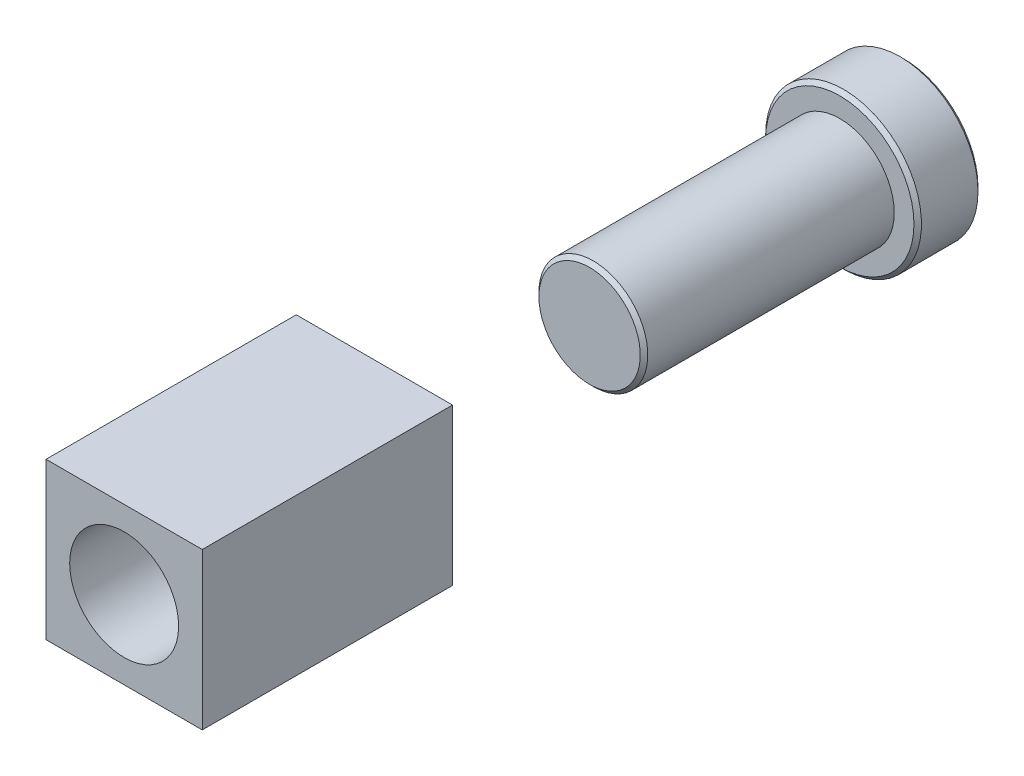
ISO-10303-21;
HEADER;
FILE_DESCRIPTION(('STEP AP214'),'2;1');
FILE_NAME('part.step','',(''),(''),'','','');
FILE_SCHEMA(('AUTOMOTIVE_DESIGN { 1 0 10303 214 1 1 1 1 }'));
ENDSEC;
DATA;
#1=APPLICATION_CONTEXT('core data for automotive mechanical design processes');
#2=APPLICATION_PROTOCOL_DEFINITION('international standard','automotive_design',2000,#1);
#3=PRODUCT_CONTEXT('',#1,'mechanical');
#4=PRODUCT('Part','Part','',(#3));
#5=PRODUCT_RELATED_PRODUCT_CATEGORY('part','',(#4));
#6=PRODUCT_DEFINITION_FORMATION('','',#4);
#7=PRODUCT_DEFINITION_CONTEXT('part definition',#1,'design');
#8=PRODUCT_DEFINITION('design','',#6,#7);
#9=PRODUCT_DEFINITION_SHAPE('','',#8);
#10=(LENGTH_UNIT() NAMED_UNIT(*) SI_UNIT(.MILLI.,.METRE.));
#11=(NAMED_UNIT(*) PLANE_ANGLE_UNIT() SI_UNIT($,.RADIAN.));
#12=(NAMED_UNIT(*) SI_UNIT($,.STERADIAN.) SOLID_ANGLE_UNIT());
#13=UNCERTAINTY_MEASURE_WITH_UNIT(LENGTH_MEASURE(1.E-05),#10,'distance_accuracy_value','');
#14=(GEOMETRIC_REPRESENTATION_CONTEXT(3) GLOBAL_UNCERTAINTY_ASSIGNED_CONTEXT((#13)) GLOBAL_UNIT_ASSIGNED_CONTEXT((#10,
#11,#12)) REPRESENTATION_CONTEXT('',''));
#15=CARTESIAN_POINT('',(0.,0.,0.));
#16=DIRECTION('',(0.,0.,1.));
#17=DIRECTION('',(1.,0.,0.));
#18=AXIS2_PLACEMENT_3D('',#15,#16,#17);
#19=CARTESIAN_POINT('',(-15.8613491960392,15.8613491960392,158.283276511442));
#20=DIRECTION('',(1.,0.,0.));
#21=DIRECTION('',(0.,1.,0.));
#22=AXIS2_PLACEMENT_3D('',#19,#20,#21);
#23=PLANE('',#22);
#24=DIRECTION('',(0.,-1.,0.));
#25=VECTOR('',#24,1.);
#26=CARTESIAN_POINT('',(-15.8613491960392,15.8613491960392,107.483276511442));
#27=LINE('',#26,#25);
#28=CARTESIAN_POINT('',(-15.8613491960392,15.8613491960392,107.483276511442));
#29=VERTEX_POINT('',#28);
#30=CARTESIAN_POINT('',(-15.8613491960392,-15.8613491960392,107.483276511442));
#31=VERTEX_POINT('',#30);
#32=EDGE_CURVE('E110',#29,#31,#27,.T.);
#33=ORIENTED_EDGE('',*,*,#32,.T.);
#34=DIRECTION('',(0.,0.,-1.));
#35=VECTOR('',#34,1.);
#36=CARTESIAN_POINT('',(-15.8613491960392,-15.8613491960392,158.283276511442));
#37=LINE('',#36,#35);
#38=CARTESIAN_POINT('',(-15.8613491960392,-15.8613491960392,158.283276511442));
#39=VERTEX_POINT('',#38);
#40=EDGE_CURVE('E12',#39,#31,#37,.T.);
#41=ORIENTED_EDGE('',*,*,#40,.F.);
#42=DIRECTION('',(0.,-1.,0.));
#43=VECTOR('',#42,1.);
#44=CARTESIAN_POINT('',(-15.8613491960392,15.8613491960392,158.283276511442));
#45=LINE('',#44,#43);
#46=CARTESIAN_POINT('',(-15.8613491960392,15.8613491960392,158.283276511442));
#47=VERTEX_POINT('',#46);
#48=EDGE_CURVE('E98',#47,#39,#45,.T.);
#49=ORIENTED_EDGE('',*,*,#48,.F.);
#50=DIRECTION('',(0.,0.,-1.));
#51=VECTOR('',#50,1.);
#52=CARTESIAN_POINT('',(-15.8613491960392,15.8613491960392,158.283276511442));
#53=LINE('',#52,#51);
#54=EDGE_CURVE('E106',#47,#29,#53,.T.);
#55=ORIENTED_EDGE('',*,*,#54,.T.);
#56=EDGE_LOOP('',(#33,#41,#49,#55));
#57=FACE_BOUND('',#56,.T.);
#58=ADVANCED_FACE('F47',(#57),#23,.F.);
#59=CARTESIAN_POINT('',(-15.8613491960392,-15.8613491960392,158.283276511442));
#60=DIRECTION('',(0.,1.,0.));
#61=DIRECTION('',(0.,0.,1.));
#62=AXIS2_PLACEMENT_3D('',#59,#60,#61);
#63=PLANE('',#62);
#64=DIRECTION('',(1.,0.,0.));
#65=VECTOR('',#64,1.);
#66=CARTESIAN_POINT('',(-15.8613491960392,-15.8613491960392,107.483276511442));
#67=LINE('',#66,#65);
#68=CARTESIAN_POINT('',(15.8613491960392,-15.8613491960392,107.483276511442));
#69=VERTEX_POINT('',#68);
#70=EDGE_CURVE('E102',#31,#69,#67,.T.);
#71=ORIENTED_EDGE('',*,*,#70,.T.);
#72=DIRECTION('',(0.,0.,-1.));
#73=VECTOR('',#72,1.);
#74=CARTESIAN_POINT('',(15.8613491960392,-15.8613491960392,158.283276511442));
#75=LINE('',#74,#73);
#76=CARTESIAN_POINT('',(15.8613491960392,-15.8613491960392,158.283276511442));
#77=VERTEX_POINT('',#76);
#78=EDGE_CURVE('E55',#77,#69,#75,.T.);
#79=ORIENTED_EDGE('',*,*,#78,.F.);
#80=DIRECTION('',(1.,0.,0.));
#81=VECTOR('',#80,1.);
#82=CARTESIAN_POINT('',(-15.8613491960392,-15.8613491960392,158.283276511442));
#83=LINE('',#82,#81);
#84=EDGE_CURVE('E93',#39,#77,#83,.T.);
#85=ORIENTED_EDGE('',*,*,#84,.F.);
#86=ORIENTED_EDGE('',*,*,#40,.T.);
#87=EDGE_LOOP('',(#71,#79,#85,#86));
#88=FACE_BOUND('',#87,.T.);
#89=ADVANCED_FACE('F101',(#88),#63,.F.);
#90=CARTESIAN_POINT('',(15.8613491960392,15.8613491960392,158.283276511442));
#91=DIRECTION('',(-1.,0.,0.));
#92=DIRECTION('',(0.,-1.,0.));
#93=AXIS2_PLACEMENT_3D('',#90,#91,#92);
#94=PLANE('',#93);
#95=DIRECTION('',(0.,1.,0.));
#96=VECTOR('',#95,1.);
#97=CARTESIAN_POINT('',(15.8613491960392,15.8613491960392,107.483276511442));
#98=LINE('',#97,#96);
#99=CARTESIAN_POINT('',(15.8613491960392,15.8613491960392,107.483276511442));
#100=VERTEX_POINT('',#99);
#101=EDGE_CURVE('E80',#69,#100,#98,.T.);
#102=ORIENTED_EDGE('',*,*,#101,.T.);
#103=DIRECTION('',(0.,0.,-1.));
#104=VECTOR('',#103,1.);
#105=CARTESIAN_POINT('',(15.8613491960392,15.8613491960392,158.283276511442));
#106=LINE('',#105,#104);
#107=CARTESIAN_POINT('',(15.8613491960392,15.8613491960392,158.283276511442));
#108=VERTEX_POINT('',#107);
#109=EDGE_CURVE('E103',#108,#100,#106,.T.);
#110=ORIENTED_EDGE('',*,*,#109,.F.);
#111=DIRECTION('',(0.,1.,0.));
#112=VECTOR('',#111,1.);
#113=CARTESIAN_POINT('',(15.8613491960392,15.8613491960392,158.283276511442));
#114=LINE('',#113,#112);
#115=EDGE_CURVE('E96',#77,#108,#114,.T.);
#116=ORIENTED_EDGE('',*,*,#115,.F.);
#117=ORIENTED_EDGE('',*,*,#78,.T.);
#118=EDGE_LOOP('',(#102,#110,#116,#117));
#119=FACE_BOUND('',#118,.T.);
#120=ADVANCED_FACE('F104',(#119),#94,.F.);
#121=CARTESIAN_POINT('',(-15.8613491960392,15.8613491960392,158.283276511442));
#122=DIRECTION('',(0.,-1.,0.));
#123=DIRECTION('',(0.,0.,-1.));
#124=AXIS2_PLACEMENT_3D('',#121,#122,#123);
#125=PLANE('',#124);
#126=DIRECTION('',(-1.,0.,0.));
#127=VECTOR('',#126,1.);
#128=CARTESIAN_POINT('',(-15.8613491960392,15.8613491960392,107.483276511442));
#129=LINE('',#128,#127);
#130=EDGE_CURVE('E86',#100,#29,#129,.T.);
#131=ORIENTED_EDGE('',*,*,#130,.T.);
#132=ORIENTED_EDGE('',*,*,#54,.F.);
#133=DIRECTION('',(-1.,0.,0.));
#134=VECTOR('',#133,1.);
#135=CARTESIAN_POINT('',(-15.8613491960392,15.8613491960392,158.283276511442));
#136=LINE('',#135,#134);
#137=EDGE_CURVE('E63',#108,#47,#136,.T.);
#138=ORIENTED_EDGE('',*,*,#137,.F.);
#139=ORIENTED_EDGE('',*,*,#109,.T.);
#140=EDGE_LOOP('',(#131,#132,#138,#139));
#141=FACE_BOUND('',#140,.T.);
#142=ADVANCED_FACE('F118',(#141),#125,.F.);
#143=CARTESIAN_POINT('',(0.,0.,158.283276511442));
#144=DIRECTION('',(0.,0.,1.));
#145=DIRECTION('',(1.,0.,0.));
#146=AXIS2_PLACEMENT_3D('',#143,#144,#145);
#147=PLANE('',#146);
#148=CARTESIAN_POINT('',(0.,0.,158.283276511442));
#149=DIRECTION('',(0.,0.,-1.));
#150=DIRECTION('',(-1.,0.,0.));
#151=AXIS2_PLACEMENT_3D('',#148,#149,#150);
#152=CIRCLE('',#151,11.05535);
#153=CARTESIAN_POINT('',(-11.05535,0.,158.283276511442));
#154=VERTEX_POINT('',#153);
#155=EDGE_CURVE('E113',#154,#154,#152,.T.);
#156=ORIENTED_EDGE('',*,*,#155,.T.);
#157=EDGE_LOOP('',(#156));
#158=FACE_BOUND('',#157,.T.);
#159=ORIENTED_EDGE('',*,*,#48,.T.);
#160=ORIENTED_EDGE('',*,*,#84,.T.);
#161=ORIENTED_EDGE('',*,*,#115,.T.);
#162=ORIENTED_EDGE('',*,*,#137,.T.);
#163=EDGE_LOOP('',(#159,#160,#161,#162));
#164=FACE_BOUND('',#163,.T.);
#165=ADVANCED_FACE('F94',(#158,#164),#147,.T.);
#166=CARTESIAN_POINT('',(0.,0.,107.483276511442));
#167=DIRECTION('',(0.,0.,1.));
#168=DIRECTION('',(1.,0.,0.));
#169=AXIS2_PLACEMENT_3D('',#166,#167,#168);
#170=PLANE('',#169);
#171=CARTESIAN_POINT('',(0.,0.,107.483276511442));
#172=DIRECTION('',(0.,0.,-1.));
#173=DIRECTION('',(-1.,0.,0.));
#174=AXIS2_PLACEMENT_3D('',#171,#172,#173);
#175=CIRCLE('',#174,11.05535);
#176=CARTESIAN_POINT('',(-11.05535,0.,107.483276511442));
#177=VERTEX_POINT('',#176);
#178=EDGE_CURVE('E124',#177,#177,#175,.T.);
#179=ORIENTED_EDGE('',*,*,#178,.F.);
#180=EDGE_LOOP('',(#179));
#181=FACE_BOUND('',#180,.T.);
#182=ORIENTED_EDGE('',*,*,#32,.F.);
#183=ORIENTED_EDGE('',*,*,#130,.F.);
#184=ORIENTED_EDGE('',*,*,#101,.F.);
#185=ORIENTED_EDGE('',*,*,#70,.F.);
#186=EDGE_LOOP('',(#182,#183,#184,#185));
#187=FACE_BOUND('',#186,.T.);
#188=ADVANCED_FACE('F121',(#181,#187),#170,.F.);
#189=CARTESIAN_POINT('',(0.,0.,158.283276511442));
#190=DIRECTION('',(0.,0.,-1.));
#191=DIRECTION('',(-1.,0.,0.));
#192=AXIS2_PLACEMENT_3D('',#189,#190,#191);
#193=CYLINDRICAL_SURFACE('',#192,11.05535);
#194=ORIENTED_EDGE('',*,*,#155,.F.);
#195=EDGE_LOOP('',(#194));
#196=FACE_BOUND('',#195,.T.);
#197=ORIENTED_EDGE('',*,*,#178,.T.);
#198=EDGE_LOOP('',(#197));
#199=FACE_BOUND('',#198,.T.);
#200=ADVANCED_FACE('F131',(#196,#199),#193,.F.);
#201=CLOSED_SHELL('',(#58,#89,#120,#142,#165,#188,#200));
#202=MANIFOLD_SOLID_BREP('B2',#201);
#203=CARTESIAN_POINT('',(0.,0.,12.9988235294118));
#204=DIRECTION('',(0.,0.,1.));
#205=DIRECTION('',(1.,0.,0.));
#206=AXIS2_PLACEMENT_3D('',#203,#204,#205);
#207=PLANE('',#206);
#208=CARTESIAN_POINT('',(0.,0.,12.9988235294118));
#209=DIRECTION('',(0.,0.,1.));
#210=DIRECTION('',(1.,0.,0.));
#211=AXIS2_PLACEMENT_3D('',#208,#209,#210);
#212=CIRCLE('',#211,15.0495000000001);
#213=CARTESIAN_POINT('',(15.0495000000001,0.,12.9988235294118));
#214=VERTEX_POINT('',#213);
#215=EDGE_CURVE('E203',#214,#214,#212,.T.);
#216=ORIENTED_EDGE('',*,*,#215,.T.);
#217=EDGE_LOOP('',(#216));
#218=FACE_BOUND('',#217,.T.);
#219=CARTESIAN_POINT('',(0.,0.,12.9988235294118));
#220=DIRECTION('',(0.,0.,1.));
#221=DIRECTION('',(1.,0.,0.));
#222=AXIS2_PLACEMENT_3D('',#219,#220,#221);
#223=CIRCLE('',#222,11.049);
#224=CARTESIAN_POINT('',(11.049,0.,12.9988235294118));
#225=VERTEX_POINT('',#224);
#226=EDGE_CURVE('E218',#225,#225,#223,.T.);
#227=ORIENTED_EDGE('',*,*,#226,.F.);
#228=EDGE_LOOP('',(#227));
#229=FACE_BOUND('',#228,.T.);
#230=ADVANCED_FACE('F192',(#218,#229),#207,.T.);
#231=CARTESIAN_POINT('',(0.,0.,12.9988235294118));
#232=DIRECTION('',(0.,0.,-1.));
#233=DIRECTION('',(-1.,0.,0.));
#234=AXIS2_PLACEMENT_3D('',#231,#232,#233);
#235=CYLINDRICAL_SURFACE('',#234,15.8115);
#236=CARTESIAN_POINT('',(0.,0.,0.762000000000034));
#237=DIRECTION('',(0.,0.,1.));
#238=DIRECTION('',(1.,0.,0.));
#239=AXIS2_PLACEMENT_3D('',#236,#237,#238);
#240=CIRCLE('',#239,15.8115);
#241=CARTESIAN_POINT('',(-15.8115,0.,0.762000000000032));
#242=VERTEX_POINT('',#241);
#243=EDGE_CURVE('E212',#242,#242,#240,.T.);
#244=CARTESIAN_POINT('',(0.,0.,12.2368235294118));
#245=DIRECTION('',(0.,0.,1.));
#246=DIRECTION('',(1.,0.,0.));
#247=AXIS2_PLACEMENT_3D('',#244,#245,#246);
#248=CIRCLE('',#247,15.8115);
#249=CARTESIAN_POINT('',(-15.8115,0.,12.2368235294118));
#250=VERTEX_POINT('',#249);
#251=EDGE_CURVE('E215',#250,#250,#248,.F.);
#252=CARTESIAN_POINT('',(-15.8115,0.,0.762000000000032));
#253=CARTESIAN_POINT('',(-15.8115,0.,0.881529411764738));
#254=CARTESIAN_POINT('',(-15.8115,0.,1.00105882352944));
#255=CARTESIAN_POINT('',(-15.8115,0.,1.24011764705886));
#256=CARTESIAN_POINT('',(-15.8115,0.,1.35964705882356));
#257=CARTESIAN_POINT('',(-15.8115,0.,1.59870588235297));
#258=CARTESIAN_POINT('',(-15.8115,0.,1.71823529411768));
#259=CARTESIAN_POINT('',(-15.8115,0.,1.95729411764709));
#260=CARTESIAN_POINT('',(-15.8115,0.,2.0768235294118));
#261=CARTESIAN_POINT('',(-15.8115,0.,2.31588235294121));
#262=CARTESIAN_POINT('',(-15.8115,0.,2.43541176470592));
#263=CARTESIAN_POINT('',(-15.8115,0.,2.67447058823533));
#264=CARTESIAN_POINT('',(-15.8115,0.,2.79400000000004));
#265=CARTESIAN_POINT('',(-15.8115,0.,3.03305882352945));
#266=CARTESIAN_POINT('',(-15.8115,0.,3.15258823529415));
#267=CARTESIAN_POINT('',(-15.8115,0.,3.39164705882357));
#268=CARTESIAN_POINT('',(-15.8115,0.,3.51117647058827));
#269=CARTESIAN_POINT('',(-15.8115,0.,3.75023529411768));
#270=CARTESIAN_POINT('',(-15.8115,0.,3.86976470588239));
#271=CARTESIAN_POINT('',(-15.8115,0.,4.1088235294118));
#272=CARTESIAN_POINT('',(-15.8115,0.,4.22835294117651));
#273=CARTESIAN_POINT('',(-15.8115,0.,4.46741176470592));
#274=CARTESIAN_POINT('',(-15.8115,0.,4.58694117647063));
#275=CARTESIAN_POINT('',(-15.8115,0.,4.82600000000004));
#276=CARTESIAN_POINT('',(-15.8115,0.,4.94552941176475));
#277=CARTESIAN_POINT('',(-15.8115,0.,5.18458823529416));
#278=CARTESIAN_POINT('',(-15.8115,0.,5.30411764705886));
#279=CARTESIAN_POINT('',(-15.8115,0.,5.54317647058827));
#280=CARTESIAN_POINT('',(-15.8115,0.,5.66270588235298));
#281=CARTESIAN_POINT('',(-15.8115,0.,5.90176470588239));
#282=CARTESIAN_POINT('',(-15.8115,0.,6.0212941176471));
#283=CARTESIAN_POINT('',(-15.8115,0.,6.26035294117651));
#284=CARTESIAN_POINT('',(-15.8115,0.,6.37988235294122));
#285=CARTESIAN_POINT('',(-15.8115,0.,6.61894117647063));
#286=CARTESIAN_POINT('',(-15.8115,0.,6.73847058823534));
#287=CARTESIAN_POINT('',(-15.8115,0.,6.97752941176475));
#288=CARTESIAN_POINT('',(-15.8115,0.,7.09705882352945));
#289=CARTESIAN_POINT('',(-15.8115,0.,7.33611764705887));
#290=CARTESIAN_POINT('',(-15.8115,0.,7.45564705882357));
#291=CARTESIAN_POINT('',(-15.8115,0.,7.69470588235298));
#292=CARTESIAN_POINT('',(-15.8115,0.,7.81423529411769));
#293=CARTESIAN_POINT('',(-15.8115,0.,8.0532941176471));
#294=CARTESIAN_POINT('',(-15.8115,0.,8.17282352941181));
#295=CARTESIAN_POINT('',(-15.8115,0.,8.41188235294122));
#296=CARTESIAN_POINT('',(-15.8115,0.,8.53141176470593));
#297=CARTESIAN_POINT('',(-15.8115,0.,8.77047058823534));
#298=CARTESIAN_POINT('',(-15.8115,0.,8.89000000000004));
#299=CARTESIAN_POINT('',(-15.8115,0.,9.12905882352946));
#300=CARTESIAN_POINT('',(-15.8115,0.,9.24858823529416));
#301=CARTESIAN_POINT('',(-15.8115,0.,9.48764705882357));
#302=CARTESIAN_POINT('',(-15.8115,0.,9.60717647058828));
#303=CARTESIAN_POINT('',(-15.8115,0.,9.84623529411769));
#304=CARTESIAN_POINT('',(-15.8115,0.,9.9657647058824));
#305=CARTESIAN_POINT('',(-15.8115,0.,10.2048235294118));
#306=CARTESIAN_POINT('',(-15.8115,0.,10.3243529411765));
#307=CARTESIAN_POINT('',(-15.8115,0.,10.5634117647059));
#308=CARTESIAN_POINT('',(-15.8115,0.,10.6829411764706));
#309=CARTESIAN_POINT('',(-15.8115,0.,10.922));
#310=CARTESIAN_POINT('',(-15.8115,0.,11.0415294117648));
#311=CARTESIAN_POINT('',(-15.8115,0.,11.2805882352942));
#312=CARTESIAN_POINT('',(-15.8115,0.,11.4001176470589));
#313=CARTESIAN_POINT('',(-15.8115,0.,11.6391764705883));
#314=CARTESIAN_POINT('',(-15.8115,0.,11.758705882353));
#315=CARTESIAN_POINT('',(-15.8115,0.,11.9977647058824));
#316=CARTESIAN_POINT('',(-15.8115,0.,12.1172941176471));
#317=CARTESIAN_POINT('',(-15.8115,0.,12.2368235294118));
#318=B_SPLINE_CURVE_WITH_KNOTS('',3,(#252,#253,#254,#255,#256,#257,#258,#259,#260,#261,#262,
#263,#264,#265,#266,#267,#268,#269,#270,#271,#272,#273,#274,#275,#276,#277,#278,#279,#280,#281,
#282,#283,#284,#285,#286,#287,#288,#289,#290,#291,#292,#293,#294,#295,#296,#297,#298,#299,#300,
#301,#302,#303,#304,#305,#306,#307,#308,#309,#310,#311,#312,#313,#314,#315,#316,#317),
.UNSPECIFIED.,.F.,.F.,(4,2,2,2,2,2,2,2,2,2,2,2,2,2,2,2,2,2,2,2,2,2,2,2,2,2,2,2,2,2,2,2,4),(0.,
0.358588235294117,0.717176470588237,1.07576470588235,1.43435294117647,1.79294117647059,
2.15152941176471,2.51011764705883,2.86870588235295,3.22729411764706,3.58588235294118,
3.9444705882353,4.30305882352942,4.66164705882354,5.02023529411766,5.37882352941177,
5.73741176470589,6.09600000000001,6.45458823529413,6.81317647058825,7.17176470588237,
7.53035294117648,7.8889411764706,8.24752941176472,8.60611764705884,8.96470588235296,
9.32329411764707,9.68188235294119,10.0404705882353,10.3990588235294,10.7576470588235,
11.1162352941177,11.4748235294118),.UNSPECIFIED.);
#319=EDGE_CURVE('BSEAM225',#242,#250,#318,.T.);
#320=ORIENTED_EDGE('',*,*,#243,.T.);
#321=ORIENTED_EDGE('',*,*,#251,.T.);
#322=ORIENTED_EDGE('',*,*,#319,.T.);
#323=ORIENTED_EDGE('',*,*,#319,.F.);
#324=EDGE_LOOP('',(#320,#322,#321,#323));
#325=FACE_BOUND('',#324,.T.);
#326=ADVANCED_FACE('F225',(#325),#235,.T.);
#327=CARTESIAN_POINT('',(0.,0.,0.));
#328=DIRECTION('',(0.,0.,1.));
#329=DIRECTION('',(1.,0.,0.));
#330=AXIS2_PLACEMENT_3D('',#327,#328,#329);
#331=PLANE('',#330);
#332=CARTESIAN_POINT('',(0.,0.,0.));
#333=DIRECTION('',(0.,0.,1.));
#334=DIRECTION('',(1.,0.,0.));
#335=AXIS2_PLACEMENT_3D('',#332,#333,#334);
#336=CIRCLE('',#335,15.0495);
#337=CARTESIAN_POINT('',(15.0495,0.,0.));
#338=VERTEX_POINT('',#337);
#339=EDGE_CURVE('E207',#338,#338,#336,.F.);
#340=ORIENTED_EDGE('',*,*,#339,.T.);
#341=EDGE_LOOP('',(#340));
#342=FACE_BOUND('',#341,.T.);
#343=ADVANCED_FACE('F231',(#342),#331,.F.);
#344=CARTESIAN_POINT('',(0.,0.,63.7988235294118));
#345=DIRECTION('',(0.,0.,-1.));
#346=DIRECTION('',(-1.,0.,0.));
#347=AXIS2_PLACEMENT_3D('',#344,#345,#346);
#348=CYLINDRICAL_SURFACE('',#347,11.049);
#349=CARTESIAN_POINT('',(0.,0.,63.0368235294118));
#350=DIRECTION('',(0.,0.,1.));
#351=DIRECTION('',(1.,0.,0.));
#352=AXIS2_PLACEMENT_3D('',#349,#350,#351);
#353=CIRCLE('',#352,11.049);
#354=CARTESIAN_POINT('',(-11.049,0.,63.0368235294117));
#355=VERTEX_POINT('',#354);
#356=EDGE_CURVE('E46',#355,#355,#353,.F.);
#357=ORIENTED_EDGE('',*,*,#356,.T.);
#358=EDGE_LOOP('',(#357));
#359=FACE_BOUND('',#358,.T.);
#360=ORIENTED_EDGE('',*,*,#226,.T.);
#361=EDGE_LOOP('',(#360));
#362=FACE_BOUND('',#361,.T.);
#363=ADVANCED_FACE('F222',(#359,#362),#348,.T.);
#364=CARTESIAN_POINT('',(0.,0.,63.7988235294118));
#365=DIRECTION('',(0.,0.,1.));
#366=DIRECTION('',(1.,0.,0.));
#367=AXIS2_PLACEMENT_3D('',#364,#365,#366);
#368=PLANE('',#367);
#369=CARTESIAN_POINT('',(0.,0.,63.7988235294118));
#370=DIRECTION('',(0.,0.,1.));
#371=DIRECTION('',(1.,0.,0.));
#372=AXIS2_PLACEMENT_3D('',#369,#370,#371);
#373=CIRCLE('',#372,10.287);
#374=CARTESIAN_POINT('',(-10.287,0.,63.7988235294118));
#375=VERTEX_POINT('',#374);
#376=EDGE_CURVE('E199',#375,#375,#373,.T.);
#377=ORIENTED_EDGE('',*,*,#376,.T.);
#378=EDGE_LOOP('',(#377));
#379=FACE_BOUND('',#378,.T.);
#380=ADVANCED_FACE('F243',(#379),#368,.T.);
#381=CARTESIAN_POINT('',(0.,0.,0.762000000000034));
#382=DIRECTION('',(0.,0.,1.));
#383=DIRECTION('',(1.,0.,0.));
#384=AXIS2_PLACEMENT_3D('',#381,#382,#383);
#385=CONICAL_SURFACE('',#384,15.8115,0.785398163397453);
#386=ORIENTED_EDGE('',*,*,#339,.F.);
#387=EDGE_LOOP('',(#386));
#388=FACE_BOUND('',#387,.T.);
#389=ORIENTED_EDGE('',*,*,#243,.F.);
#390=EDGE_LOOP('',(#389));
#391=FACE_BOUND('',#390,.T.);
#392=ADVANCED_FACE('F240',(#388,#391),#385,.T.);
#393=CARTESIAN_POINT('',(0.,0.,12.9988235294118));
#394=DIRECTION('',(0.,0.,-1.));
#395=DIRECTION('',(-1.,0.,0.));
#396=AXIS2_PLACEMENT_3D('',#393,#394,#395);
#397=CONICAL_SURFACE('',#396,15.0495000000001,0.785398163397446);
#398=ORIENTED_EDGE('',*,*,#251,.F.);
#399=EDGE_LOOP('',(#398));
#400=FACE_BOUND('',#399,.T.);
#401=ORIENTED_EDGE('',*,*,#215,.F.);
#402=EDGE_LOOP('',(#401));
#403=FACE_BOUND('',#402,.T.);
#404=ADVANCED_FACE('F242',(#400,#403),#397,.T.);
#405=CARTESIAN_POINT('',(0.,0.,63.7988235294118));
#406=DIRECTION('',(0.,0.,-1.));
#407=DIRECTION('',(-1.,0.,0.));
#408=AXIS2_PLACEMENT_3D('',#405,#406,#407);
#409=CONICAL_SURFACE('',#408,10.287,0.785398163397446);
#410=CARTESIAN_POINT('',(-11.049,0.,63.0368235294117));
#411=CARTESIAN_POINT('',(-11.0410625,0.,63.0447610294118));
#412=CARTESIAN_POINT('',(-11.033125,0.,63.0526985294118));
#413=CARTESIAN_POINT('',(-11.01725,0.,63.0685735294118));
#414=CARTESIAN_POINT('',(-11.0093125,0.,63.0765110294118));
#415=CARTESIAN_POINT('',(-10.9934375,0.,63.0923860294117));
#416=CARTESIAN_POINT('',(-10.9855,0.,63.1003235294118));
#417=CARTESIAN_POINT('',(-10.969625,0.,63.1161985294117));
#418=CARTESIAN_POINT('',(-10.9616875,0.,63.1241360294118));
#419=CARTESIAN_POINT('',(-10.9458125,0.,63.1400110294117));
#420=CARTESIAN_POINT('',(-10.937875,0.,63.1479485294117));
#421=CARTESIAN_POINT('',(-10.922,0.,63.1638235294117));
#422=CARTESIAN_POINT('',(-10.9140625,0.,63.1717610294118));
#423=CARTESIAN_POINT('',(-10.8981875,0.,63.1876360294118));
#424=CARTESIAN_POINT('',(-10.89025,0.,63.1955735294118));
#425=CARTESIAN_POINT('',(-10.874375,0.,63.2114485294118));
#426=CARTESIAN_POINT('',(-10.8664375,0.,63.2193860294118));
#427=CARTESIAN_POINT('',(-10.8505625,0.,63.2352610294118));
#428=CARTESIAN_POINT('',(-10.842625,0.,63.2431985294117));
#429=CARTESIAN_POINT('',(-10.82675,0.,63.2590735294118));
#430=CARTESIAN_POINT('',(-10.8188125,0.,63.2670110294117));
#431=CARTESIAN_POINT('',(-10.8029375,0.,63.2828860294117));
#432=CARTESIAN_POINT('',(-10.795,0.,63.2908235294118));
#433=CARTESIAN_POINT('',(-10.779125,0.,63.3066985294118));
#434=CARTESIAN_POINT('',(-10.7711875,0.,63.3146360294118));
#435=CARTESIAN_POINT('',(-10.7553125,0.,63.3305110294118));
#436=CARTESIAN_POINT('',(-10.747375,0.,63.3384485294118));
#437=CARTESIAN_POINT('',(-10.7315,0.,63.3543235294118));
#438=CARTESIAN_POINT('',(-10.7235625,0.,63.3622610294118));
#439=CARTESIAN_POINT('',(-10.7076875,0.,63.3781360294117));
#440=CARTESIAN_POINT('',(-10.69975,0.,63.3860735294118));
#441=CARTESIAN_POINT('',(-10.683875,0.,63.4019485294117));
#442=CARTESIAN_POINT('',(-10.6759375,0.,63.4098860294118));
#443=CARTESIAN_POINT('',(-10.6600625,0.,63.4257610294117));
#444=CARTESIAN_POINT('',(-10.652125,0.,63.4336985294118));
#445=CARTESIAN_POINT('',(-10.63625,0.,63.4495735294118));
#446=CARTESIAN_POINT('',(-10.6283125,0.,63.4575110294118));
#447=CARTESIAN_POINT('',(-10.6124375,0.,63.4733860294118));
#448=CARTESIAN_POINT('',(-10.6045,0.,63.4813235294118));
#449=CARTESIAN_POINT('',(-10.588625,0.,63.4971985294118));
#450=CARTESIAN_POINT('',(-10.5806875,0.,63.5051360294118));
#451=CARTESIAN_POINT('',(-10.5648125,0.,63.5210110294118));
#452=CARTESIAN_POINT('',(-10.556875,0.,63.5289485294117));
#453=CARTESIAN_POINT('',(-10.541,0.,63.5448235294118));
#454=CARTESIAN_POINT('',(-10.5330625,0.,63.5527610294118));
#455=CARTESIAN_POINT('',(-10.5171875,0.,63.5686360294118));
#456=CARTESIAN_POINT('',(-10.50925,0.,63.5765735294118));
#457=CARTESIAN_POINT('',(-10.493375,0.,63.5924485294118));
#458=CARTESIAN_POINT('',(-10.4854375,0.,63.6003860294118));
#459=CARTESIAN_POINT('',(-10.4695625,0.,63.6162610294118));
#460=CARTESIAN_POINT('',(-10.461625,0.,63.6241985294118));
#461=CARTESIAN_POINT('',(-10.44575,0.,63.6400735294118));
#462=CARTESIAN_POINT('',(-10.4378125,0.,63.6480110294118));
#463=CARTESIAN_POINT('',(-10.4219375,0.,63.6638860294118));
#464=CARTESIAN_POINT('',(-10.414,0.,63.6718235294118));
#465=CARTESIAN_POINT('',(-10.398125,0.,63.6876985294118));
#466=CARTESIAN_POINT('',(-10.3901875,0.,63.6956360294118));
#467=CARTESIAN_POINT('',(-10.3743125,0.,63.7115110294118));
#468=CARTESIAN_POINT('',(-10.366375,0.,63.7194485294118));
#469=CARTESIAN_POINT('',(-10.3505,0.,63.7353235294118));
#470=CARTESIAN_POINT('',(-10.3425625,0.,63.7432610294118));
#471=CARTESIAN_POINT('',(-10.3266875,0.,63.7591360294118));
#472=CARTESIAN_POINT('',(-10.31875,0.,63.7670735294118));
#473=CARTESIAN_POINT('',(-10.302875,0.,63.7829485294118));
#474=CARTESIAN_POINT('',(-10.2949375,0.,63.7908860294118));
#475=CARTESIAN_POINT('',(-10.287,0.,63.7988235294118));
#476=B_SPLINE_CURVE_WITH_KNOTS('',3,(#410,#411,#412,#413,#414,#415,#416,#417,#418,#419,#420,
#421,#422,#423,#424,#425,#426,#427,#428,#429,#430,#431,#432,#433,#434,#435,#436,#437,#438,#439,
#440,#441,#442,#443,#444,#445,#446,#447,#448,#449,#450,#451,#452,#453,#454,#455,#456,#457,#458,
#459,#460,#461,#462,#463,#464,#465,#466,#467,#468,#469,#470,#471,#472,#473,#474,#475),
.UNSPECIFIED.,.F.,.F.,(4,2,2,2,2,2,2,2,2,2,2,2,2,2,2,2,2,2,2,2,2,2,2,2,2,2,2,2,2,2,2,2,4),(0.,
0.0336759604540172,0.0673519209080259,0.101027881362033,0.134703841816042,0.168379802270049,
0.202055762724067,0.235731723178075,0.269407683632083,0.303083644086091,0.336759604540099,
0.370435564994117,0.404111525448125,0.437787485902133,0.471463446356141,0.50513940681015,
0.538815367264157,0.572491327718174,0.606167288172183,0.63984324862619,0.673519209080199,
0.707195169534206,0.740871129988225,0.774547090442232,0.80822305089624,0.841899011350248,
0.875574971804256,0.909250932258274,0.942926892712281,0.97660285316629,1.0102788136203,
1.04395477407431,1.07763073452832),.UNSPECIFIED.);
#477=EDGE_CURVE('BSEAM194',#355,#375,#476,.T.);
#478=ORIENTED_EDGE('',*,*,#356,.F.);
#479=ORIENTED_EDGE('',*,*,#376,.F.);
#480=ORIENTED_EDGE('',*,*,#477,.T.);
#481=ORIENTED_EDGE('',*,*,#477,.F.);
#482=EDGE_LOOP('',(#478,#480,#479,#481));
#483=FACE_BOUND('',#482,.T.);
#484=ADVANCED_FACE('F194',(#483),#409,.T.);
#485=CLOSED_SHELL('',(#230,#326,#343,#363,#380,#392,#404,#484));
#486=MANIFOLD_SOLID_BREP('B6',#485);
#487=ADVANCED_BREP_SHAPE_REPRESENTATION('',(#18,#202,#486),#14);
#488=SHAPE_DEFINITION_REPRESENTATION(#9,#487);
ENDSEC;
END-ISO-10303-21;
